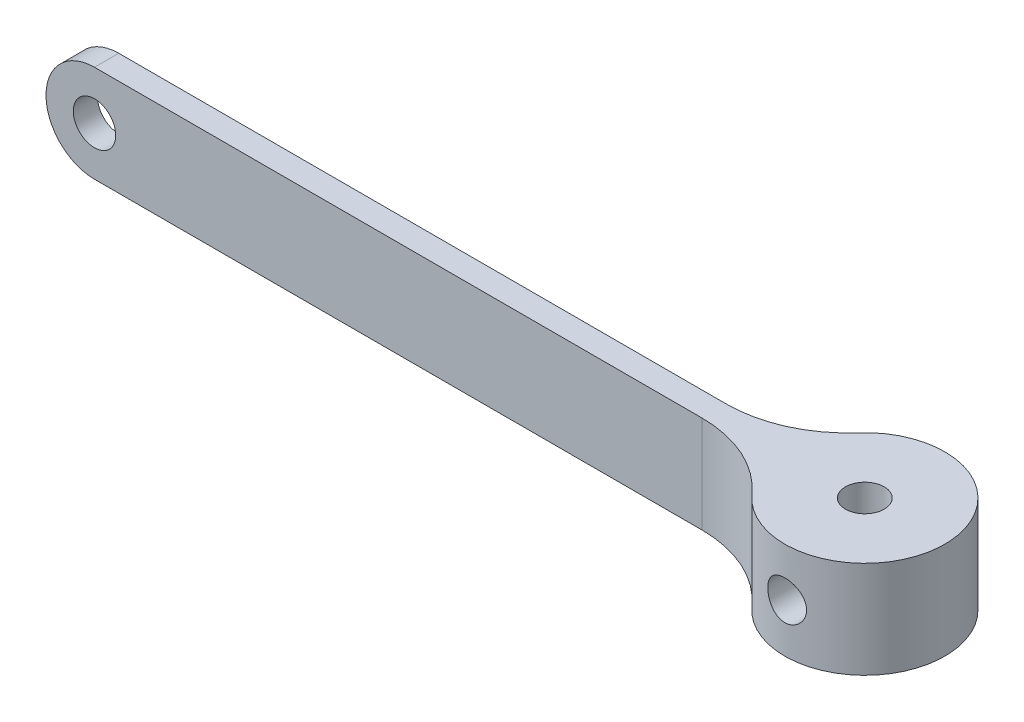
ISO-10303-21;
HEADER;
FILE_DESCRIPTION(('STEP AP214'),'2;1');
FILE_NAME('part.step','',(''),(''),'','','');
FILE_SCHEMA(('AUTOMOTIVE_DESIGN { 1 0 10303 214 1 1 1 1 }'));
ENDSEC;
DATA;
#1=APPLICATION_CONTEXT('core data for automotive mechanical design processes');
#2=APPLICATION_PROTOCOL_DEFINITION('international standard','automotive_design',2000,#1);
#3=PRODUCT_CONTEXT('',#1,'mechanical');
#4=PRODUCT('Part','Part','',(#3));
#5=PRODUCT_RELATED_PRODUCT_CATEGORY('part','',(#4));
#6=PRODUCT_DEFINITION_FORMATION('','',#4);
#7=PRODUCT_DEFINITION_CONTEXT('part definition',#1,'design');
#8=PRODUCT_DEFINITION('design','',#6,#7);
#9=PRODUCT_DEFINITION_SHAPE('','',#8);
#10=(LENGTH_UNIT() NAMED_UNIT(*) SI_UNIT(.MILLI.,.METRE.));
#11=(NAMED_UNIT(*) PLANE_ANGLE_UNIT() SI_UNIT($,.RADIAN.));
#12=(NAMED_UNIT(*) SI_UNIT($,.STERADIAN.) SOLID_ANGLE_UNIT());
#13=UNCERTAINTY_MEASURE_WITH_UNIT(LENGTH_MEASURE(1.E-05),#10,'distance_accuracy_value','');
#14=(GEOMETRIC_REPRESENTATION_CONTEXT(3) GLOBAL_UNCERTAINTY_ASSIGNED_CONTEXT((#13)) GLOBAL_UNIT_ASSIGNED_CONTEXT((#10,
#11,#12)) REPRESENTATION_CONTEXT('',''));
#15=CARTESIAN_POINT('',(0.,0.,0.));
#16=DIRECTION('',(0.,0.,1.));
#17=DIRECTION('',(1.,0.,0.));
#18=AXIS2_PLACEMENT_3D('',#15,#16,#17);
#19=CARTESIAN_POINT('',(0.,8.,0.999999999999998));
#20=DIRECTION('',(0.,0.,1.));
#21=DIRECTION('',(-1.,0.,0.));
#22=AXIS2_PLACEMENT_3D('',#19,#20,#21);
#23=PLANE('',#22);
#24=CARTESIAN_POINT('',(-62.52380257212,4.,0.999999999999998));
#25=DIRECTION('',(0.,0.,-1.));
#26=DIRECTION('',(-1.,0.,0.));
#27=AXIS2_PLACEMENT_3D('',#24,#25,#26);
#28=CIRCLE('',#27,1.75);
#29=CARTESIAN_POINT('',(-60.77380257212,4.,0.999999999999998));
#30=VERTEX_POINT('',#29);
#31=EDGE_CURVE('E126',#30,#30,#28,.T.);
#32=ORIENTED_EDGE('',*,*,#31,.T.);
#33=EDGE_LOOP('',(#32));
#34=FACE_BOUND('',#33,.T.);
#35=DIRECTION('',(1.,0.,0.));
#36=VECTOR('',#35,1.);
#37=CARTESIAN_POINT('',(0.,8.,0.999999999999998));
#38=LINE('',#37,#36);
#39=CARTESIAN_POINT('',(-62.52380257212,8.,1.));
#40=VERTEX_POINT('',#39);
#41=CARTESIAN_POINT('',(-12.432216214336,8.,0.999999999999998));
#42=VERTEX_POINT('',#41);
#43=EDGE_CURVE('E121',#40,#42,#38,.T.);
#44=ORIENTED_EDGE('',*,*,#43,.F.);
#45=CARTESIAN_POINT('',(-62.52380257212,4.,0.999999999999998));
#46=DIRECTION('',(0.,0.,-1.));
#47=DIRECTION('',(-1.,0.,0.));
#48=AXIS2_PLACEMENT_3D('',#45,#46,#47);
#49=CIRCLE('',#48,4.);
#50=CARTESIAN_POINT('',(-62.52380257212,0.,1.));
#51=VERTEX_POINT('',#50);
#52=EDGE_CURVE('E104',#51,#40,#49,.T.);
#53=ORIENTED_EDGE('',*,*,#52,.F.);
#54=DIRECTION('',(1.,0.,0.));
#55=VECTOR('',#54,1.);
#56=CARTESIAN_POINT('',(0.,0.,0.999999999999998));
#57=LINE('',#56,#55);
#58=CARTESIAN_POINT('',(-12.432216214336,0.,0.999999999999998));
#59=VERTEX_POINT('',#58);
#60=EDGE_CURVE('E114',#51,#59,#57,.T.);
#61=ORIENTED_EDGE('',*,*,#60,.T.);
#62=DIRECTION('',(0.,-1.,0.));
#63=VECTOR('',#62,1.);
#64=CARTESIAN_POINT('',(-12.432216214336,8.,0.999999999999998));
#65=LINE('',#64,#63);
#66=EDGE_CURVE('E164',#42,#59,#65,.T.);
#67=ORIENTED_EDGE('',*,*,#66,.F.);
#68=EDGE_LOOP('',(#44,#53,#61,#67));
#69=FACE_BOUND('',#68,.T.);
#70=ADVANCED_FACE('F43',(#34,#69),#23,.T.);
#71=CARTESIAN_POINT('',(0.,8.,-1.));
#72=DIRECTION('',(0.,0.,1.));
#73=DIRECTION('',(-1.,0.,0.));
#74=AXIS2_PLACEMENT_3D('',#71,#72,#73);
#75=PLANE('',#74);
#76=CARTESIAN_POINT('',(-62.52380257212,4.,-1.));
#77=DIRECTION('',(0.,0.,-1.));
#78=DIRECTION('',(-1.,0.,0.));
#79=AXIS2_PLACEMENT_3D('',#76,#77,#78);
#80=CIRCLE('',#79,1.75);
#81=CARTESIAN_POINT('',(-60.77380257212,4.,-1.));
#82=VERTEX_POINT('',#81);
#83=EDGE_CURVE('E154',#82,#82,#80,.T.);
#84=ORIENTED_EDGE('',*,*,#83,.F.);
#85=EDGE_LOOP('',(#84));
#86=FACE_BOUND('',#85,.T.);
#87=DIRECTION('',(1.,0.,0.));
#88=VECTOR('',#87,1.);
#89=CARTESIAN_POINT('',(0.,0.,-1.));
#90=LINE('',#89,#88);
#91=CARTESIAN_POINT('',(-62.52380257212,0.,-0.999999999999997));
#92=VERTEX_POINT('',#91);
#93=CARTESIAN_POINT('',(-12.432216214336,0.,-1.));
#94=VERTEX_POINT('',#93);
#95=EDGE_CURVE('E117',#92,#94,#90,.T.);
#96=ORIENTED_EDGE('',*,*,#95,.F.);
#97=CARTESIAN_POINT('',(-62.52380257212,4.,-1.));
#98=DIRECTION('',(0.,0.,-1.));
#99=DIRECTION('',(-1.,0.,0.));
#100=AXIS2_PLACEMENT_3D('',#97,#98,#99);
#101=CIRCLE('',#100,4.);
#102=CARTESIAN_POINT('',(-62.52380257212,8.,-1.));
#103=VERTEX_POINT('',#102);
#104=EDGE_CURVE('E107',#92,#103,#101,.T.);
#105=ORIENTED_EDGE('',*,*,#104,.T.);
#106=DIRECTION('',(1.,0.,0.));
#107=VECTOR('',#106,1.);
#108=CARTESIAN_POINT('',(0.,8.,-1.));
#109=LINE('',#108,#107);
#110=CARTESIAN_POINT('',(-12.432216214336,8.,-1.));
#111=VERTEX_POINT('',#110);
#112=EDGE_CURVE('E137',#103,#111,#109,.T.);
#113=ORIENTED_EDGE('',*,*,#112,.T.);
#114=DIRECTION('',(0.,1.,0.));
#115=VECTOR('',#114,1.);
#116=CARTESIAN_POINT('',(-12.432216214336,8.,-1.));
#117=LINE('',#116,#115);
#118=EDGE_CURVE('E161',#94,#111,#117,.T.);
#119=ORIENTED_EDGE('',*,*,#118,.F.);
#120=EDGE_LOOP('',(#96,#105,#113,#119));
#121=FACE_BOUND('',#120,.T.);
#122=ADVANCED_FACE('F180',(#86,#121),#75,.F.);
#123=CARTESIAN_POINT('',(0.,8.,0.));
#124=DIRECTION('',(0.,-1.,0.));
#125=DIRECTION('',(0.,0.,1.));
#126=AXIS2_PLACEMENT_3D('',#123,#124,#125);
#127=CYLINDRICAL_SURFACE('',#126,1.6);
#128=CARTESIAN_POINT('',(0.,4.,0.));
#129=DIRECTION('',(0.,0.707106781186548,0.707106781186547));
#130=DIRECTION('',(0.,-0.707106781186548,0.707106781186547));
#131=AXIS2_PLACEMENT_3D('',#128,#129,#130);
#132=ELLIPSE('',#131,2.26274169979695,1.6);
#133=CARTESIAN_POINT('',(-1.6,4.,0.));
#134=VERTEX_POINT('',#133);
#135=CARTESIAN_POINT('',(1.6,4.,0.));
#136=VERTEX_POINT('',#135);
#137=EDGE_CURVE('E150',#134,#136,#132,.F.);
#138=ORIENTED_EDGE('',*,*,#137,.T.);
#139=CARTESIAN_POINT('',(0.,4.,0.));
#140=DIRECTION('',(0.,0.707106781186548,-0.707106781186547));
#141=DIRECTION('',(0.,-0.707106781186548,-0.707106781186547));
#142=AXIS2_PLACEMENT_3D('',#139,#140,#141);
#143=ELLIPSE('',#142,2.26274169979695,1.6);
#144=EDGE_CURVE('E110',#136,#134,#143,.F.);
#145=ORIENTED_EDGE('',*,*,#144,.T.);
#146=EDGE_LOOP('',(#138,#145));
#147=FACE_BOUND('',#146,.T.);
#148=CARTESIAN_POINT('',(0.,8.,0.));
#149=DIRECTION('',(0.,-1.,0.));
#150=DIRECTION('',(0.,0.,-1.));
#151=AXIS2_PLACEMENT_3D('',#148,#149,#150);
#152=CIRCLE('',#151,1.6);
#153=CARTESIAN_POINT('',(0.,8.,-1.6));
#154=VERTEX_POINT('',#153);
#155=EDGE_CURVE('E130',#154,#154,#152,.T.);
#156=ORIENTED_EDGE('',*,*,#155,.F.);
#157=EDGE_LOOP('',(#156));
#158=FACE_BOUND('',#157,.T.);
#159=ADVANCED_FACE('F199',(#147,#158),#127,.F.);
#160=CARTESIAN_POINT('',(0.,0.,0.));
#161=DIRECTION('',(0.,1.,0.));
#162=DIRECTION('',(0.,0.,-1.));
#163=AXIS2_PLACEMENT_3D('',#160,#161,#162);
#164=PLANE('',#163);
#165=CARTESIAN_POINT('',(0.,0.,0.));
#166=DIRECTION('',(0.,-1.,0.));
#167=DIRECTION('',(0.,0.,-1.));
#168=AXIS2_PLACEMENT_3D('',#165,#166,#167);
#169=CIRCLE('',#168,1.6);
#170=CARTESIAN_POINT('',(0.,0.,-1.6));
#171=VERTEX_POINT('',#170);
#172=EDGE_CURVE('E122',#171,#171,#169,.T.);
#173=ORIENTED_EDGE('',*,*,#172,.F.);
#174=EDGE_LOOP('',(#173));
#175=FACE_BOUND('',#174,.T.);
#176=DIRECTION('',(0.,0.,-1.));
#177=VECTOR('',#176,1.);
#178=CARTESIAN_POINT('',(-62.52380257212,0.,6.6));
#179=LINE('',#178,#177);
#180=EDGE_CURVE('E101',#51,#92,#179,.T.);
#181=ORIENTED_EDGE('',*,*,#180,.T.);
#182=ORIENTED_EDGE('',*,*,#95,.T.);
#183=CARTESIAN_POINT('',(-12.432216214336,0.,-11.));
#184=DIRECTION('',(0.,-1.,0.));
#185=DIRECTION('',(0.,0.,-1.));
#186=AXIS2_PLACEMENT_3D('',#183,#184,#185);
#187=CIRCLE('',#186,10.);
#188=CARTESIAN_POINT('',(-4.94292933822999,0.,-4.37349397590361));
#189=VERTEX_POINT('',#188);
#190=EDGE_CURVE('E166',#189,#94,#187,.T.);
#191=ORIENTED_EDGE('',*,*,#190,.F.);
#192=CARTESIAN_POINT('',(0.,0.,0.));
#193=DIRECTION('',(0.,-1.,0.));
#194=DIRECTION('',(0.,0.,-1.));
#195=AXIS2_PLACEMENT_3D('',#192,#193,#194);
#196=CIRCLE('',#195,6.6);
#197=CARTESIAN_POINT('',(-4.94292933822999,0.,4.37349397590361));
#198=VERTEX_POINT('',#197);
#199=EDGE_CURVE('E118',#189,#198,#196,.T.);
#200=ORIENTED_EDGE('',*,*,#199,.T.);
#201=CARTESIAN_POINT('',(-12.432216214336,0.,11.));
#202=DIRECTION('',(0.,-1.,0.));
#203=DIRECTION('',(0.,0.,-1.));
#204=AXIS2_PLACEMENT_3D('',#201,#202,#203);
#205=CIRCLE('',#204,10.);
#206=EDGE_CURVE('E51',#59,#198,#205,.T.);
#207=ORIENTED_EDGE('',*,*,#206,.F.);
#208=ORIENTED_EDGE('',*,*,#60,.F.);
#209=EDGE_LOOP('',(#181,#182,#191,#200,#207,#208));
#210=FACE_BOUND('',#209,.T.);
#211=ADVANCED_FACE('F115',(#175,#210),#164,.F.);
#212=CARTESIAN_POINT('',(0.,8.,0.));
#213=DIRECTION('',(0.,1.,0.));
#214=DIRECTION('',(0.,0.,-1.));
#215=AXIS2_PLACEMENT_3D('',#212,#213,#214);
#216=PLANE('',#215);
#217=ORIENTED_EDGE('',*,*,#155,.T.);
#218=EDGE_LOOP('',(#217));
#219=FACE_BOUND('',#218,.T.);
#220=ORIENTED_EDGE('',*,*,#43,.T.);
#221=CARTESIAN_POINT('',(-12.432216214336,8.,11.));
#222=DIRECTION('',(0.,-1.,0.));
#223=DIRECTION('',(0.,0.,-1.));
#224=AXIS2_PLACEMENT_3D('',#221,#222,#223);
#225=CIRCLE('',#224,10.);
#226=CARTESIAN_POINT('',(-4.94292933822999,8.,4.37349397590361));
#227=VERTEX_POINT('',#226);
#228=EDGE_CURVE('E11',#227,#42,#225,.F.);
#229=ORIENTED_EDGE('',*,*,#228,.F.);
#230=CARTESIAN_POINT('',(0.,8.,0.));
#231=DIRECTION('',(0.,-1.,0.));
#232=DIRECTION('',(0.,0.,-1.));
#233=AXIS2_PLACEMENT_3D('',#230,#231,#232);
#234=CIRCLE('',#233,6.6);
#235=CARTESIAN_POINT('',(-4.94292933822999,8.,-4.37349397590361));
#236=VERTEX_POINT('',#235);
#237=EDGE_CURVE('E133',#236,#227,#234,.T.);
#238=ORIENTED_EDGE('',*,*,#237,.F.);
#239=CARTESIAN_POINT('',(-12.432216214336,8.,-11.));
#240=DIRECTION('',(0.,-1.,0.));
#241=DIRECTION('',(0.,0.,-1.));
#242=AXIS2_PLACEMENT_3D('',#239,#240,#241);
#243=CIRCLE('',#242,10.);
#244=EDGE_CURVE('E168',#111,#236,#243,.F.);
#245=ORIENTED_EDGE('',*,*,#244,.F.);
#246=ORIENTED_EDGE('',*,*,#112,.F.);
#247=DIRECTION('',(0.,0.,-1.));
#248=VECTOR('',#247,1.);
#249=CARTESIAN_POINT('',(-62.52380257212,8.,6.6));
#250=LINE('',#249,#248);
#251=EDGE_CURVE('E111',#40,#103,#250,.T.);
#252=ORIENTED_EDGE('',*,*,#251,.F.);
#253=EDGE_LOOP('',(#220,#229,#238,#245,#246,#252));
#254=FACE_BOUND('',#253,.T.);
#255=ADVANCED_FACE('F176',(#219,#254),#216,.T.);
#256=CARTESIAN_POINT('',(0.,8.,0.));
#257=DIRECTION('',(0.,-1.,0.));
#258=DIRECTION('',(0.,0.,1.));
#259=AXIS2_PLACEMENT_3D('',#256,#257,#258);
#260=CYLINDRICAL_SURFACE('',#259,6.6);
#261=CARTESIAN_POINT('',(1.6,4.,6.40312423743285));
#262=CARTESIAN_POINT('',(1.59999733947836,4.08844402406098,6.40312597037608));
#263=CARTESIAN_POINT('',(1.59264157848281,4.17691809600071,6.40497670400887));
#264=CARTESIAN_POINT('',(1.56345601743318,4.35133182154082,6.4121621325328));
#265=CARTESIAN_POINT('',(1.54161728105349,4.43726987614424,6.41749897840401));
#266=CARTESIAN_POINT('',(1.48420900234039,4.60406355514517,6.43101748536075));
#267=CARTESIAN_POINT('',(1.44865650524925,4.68492534448298,6.43919561368331));
#268=CARTESIAN_POINT('',(1.3648810998873,4.83954379086885,6.45747086045777));
#269=CARTESIAN_POINT('',(1.31665785249964,4.91330025767959,6.46756803026843));
#270=CARTESIAN_POINT('',(1.20784389900135,5.05314159602282,6.48877758318028));
#271=CARTESIAN_POINT('',(1.14703929913897,5.11905772455782,6.49990538881894));
#272=CARTESIAN_POINT('',(1.01524965153105,5.23986289597431,6.5217882988137));
#273=CARTESIAN_POINT('',(0.944263695721746,5.29475095422509,6.53254336981968));
#274=CARTESIAN_POINT('',(0.792976530006599,5.39262652396975,6.55263898037571));
#275=CARTESIAN_POINT('',(0.71256570600993,5.43544913714583,6.56195919706409));
#276=CARTESIAN_POINT('',(0.545423893058168,5.50690743021361,6.57795945463852));
#277=CARTESIAN_POINT('',(0.458693781262912,5.53554507478769,6.5846398611243));
#278=CARTESIAN_POINT('',(0.28313343703087,5.57728248350463,6.59449878121048));
#279=CARTESIAN_POINT('',(0.194374956348101,5.59066857236418,6.59774174354862));
#280=CARTESIAN_POINT('',(0.0158168750524343,5.60242074593819,6.60058464260181));
#281=CARTESIAN_POINT('',(-0.0739825787233717,5.60078892390197,6.60018508702391));
#282=CARTESIAN_POINT('',(-0.25009076322241,5.5827593886002,6.59583627033507));
#283=CARTESIAN_POINT('',(-0.336433231377963,5.56667061845232,6.59196128200833));
#284=CARTESIAN_POINT('',(-0.505154519829912,5.52067938716169,6.58118299179282));
#285=CARTESIAN_POINT('',(-0.587533136198652,5.49077621614884,6.57427953428333));
#286=CARTESIAN_POINT('',(-0.746813265295441,5.41774922909505,6.55810487467464));
#287=CARTESIAN_POINT('',(-0.8236614407911,5.37451366657421,6.54881377443151));
#288=CARTESIAN_POINT('',(-0.969121094903154,5.27613357148008,6.52887450690487));
#289=CARTESIAN_POINT('',(-1.03773121476807,5.22098707855287,6.51822611635086));
#290=CARTESIAN_POINT('',(-1.16660863727456,5.09868762962085,6.49641521034034));
#291=CARTESIAN_POINT('',(-1.22661882104947,5.03126455163238,6.48524650824044));
#292=CARTESIAN_POINT('',(-1.33453585965573,4.88719490884861,6.46390352969242));
#293=CARTESIAN_POINT('',(-1.38244221584308,4.81054796424765,6.45372929422414));
#294=CARTESIAN_POINT('',(-1.46494322915083,4.64972470273884,6.43550637883586));
#295=CARTESIAN_POINT('',(-1.4994794029305,4.56551724795948,6.42746708453676));
#296=CARTESIAN_POINT('',(-1.55382718977604,4.39225039215391,6.41454673226991));
#297=CARTESIAN_POINT('',(-1.57364174189015,4.30319196339657,6.40966504393782));
#298=CARTESIAN_POINT('',(-1.59756435294379,4.12512682937485,6.40374402358904));
#299=CARTESIAN_POINT('',(-1.60205110778769,4.03617402039503,6.40261207062851));
#300=CARTESIAN_POINT('',(-1.59622462099622,3.85879092404816,6.40406713975094));
#301=CARTESIAN_POINT('',(-1.58591265192973,3.77036059240891,6.4066538420601));
#302=CARTESIAN_POINT('',(-1.55111264233716,3.59791634012609,6.41516633208495));
#303=CARTESIAN_POINT('',(-1.52684202876438,3.51385577255964,6.42104086992378));
#304=CARTESIAN_POINT('',(-1.46505330245464,3.35099563472862,6.43541907577093));
#305=CARTESIAN_POINT('',(-1.427533693674,3.27219665978537,6.44392304067414));
#306=CARTESIAN_POINT('',(-1.33950890361332,3.12048324751841,6.46279907110407));
#307=CARTESIAN_POINT('',(-1.28877556385843,3.04770522515797,6.47320288866304));
#308=CARTESIAN_POINT('',(-1.176054449739,2.91155642689974,6.49462703788132));
#309=CARTESIAN_POINT('',(-1.11406494115952,2.84818710331931,6.50564746435902));
#310=CARTESIAN_POINT('',(-0.978859243852804,2.73113684816081,6.52737484171816));
#311=CARTESIAN_POINT('',(-0.905414542587484,2.6777169454476,6.5380684476914));
#312=CARTESIAN_POINT('',(-0.750376177663217,2.58397023624514,6.55766967940658));
#313=CARTESIAN_POINT('',(-0.66878293149163,2.54364275942034,6.56657739657757));
#314=CARTESIAN_POINT('',(-0.500317828978865,2.47756489223356,6.58154809251216));
#315=CARTESIAN_POINT('',(-0.413487967421984,2.45171216041208,6.58763099011155));
#316=CARTESIAN_POINT('',(-0.236550277056997,2.41500676666825,6.59635362322053));
#317=CARTESIAN_POINT('',(-0.146443043735652,2.40415139361489,6.5989939810466));
#318=CARTESIAN_POINT('',(0.0320330834287466,2.39789370197624,6.60051038370048));
#319=CARTESIAN_POINT('',(0.120387845166775,2.4021050810357,6.59948053308083));
#320=CARTESIAN_POINT('',(0.295090603727326,2.42498180031035,6.59397912156365));
#321=CARTESIAN_POINT('',(0.381438653778091,2.44364675669111,6.58950765206303));
#322=CARTESIAN_POINT('',(0.549299070646439,2.49469887896567,6.57763810488231));
#323=CARTESIAN_POINT('',(0.630832598167391,2.52701996018495,6.57025413266408));
#324=CARTESIAN_POINT('',(0.787364816025318,2.60440616156891,6.55333973860274));
#325=CARTESIAN_POINT('',(0.862362725594601,2.64947280163974,6.54380906079289));
#326=CARTESIAN_POINT('',(1.00554031833552,2.75226967813651,6.52336129617945));
#327=CARTESIAN_POINT('',(1.07352623332948,2.81026451788978,6.51241761643753));
#328=CARTESIAN_POINT('',(1.19893242972994,2.93675265363601,6.49050250288316));
#329=CARTESIAN_POINT('',(1.25635006733463,3.00524856878544,6.47953106282008));
#330=CARTESIAN_POINT('',(1.35995880768537,3.15221778456658,6.45858815699281));
#331=CARTESIAN_POINT('',(1.40593901379458,3.23084290180638,6.448637221504));
#332=CARTESIAN_POINT('',(1.48395977964431,3.39493550764195,6.43113315660768));
#333=CARTESIAN_POINT('',(1.51601091235572,3.48039774791219,6.42357820968792));
#334=CARTESIAN_POINT('',(1.56024691692113,3.63814570603387,6.41295817096726));
#335=CARTESIAN_POINT('',(1.57512286070378,3.70964864102359,6.40929733413103));
#336=CARTESIAN_POINT('',(1.59500013121856,3.85409430607224,6.40437974225737));
#337=CARTESIAN_POINT('',(1.60000219483265,3.92703692827776,6.40312280781832));
#338=CARTESIAN_POINT('',(1.6,4.,6.40312423743285));
#339=B_SPLINE_CURVE_WITH_KNOTS('',3,(#261,#262,#263,#264,#265,#266,#267,#268,#269,#270,#271,
#272,#273,#274,#275,#276,#277,#278,#279,#280,#281,#282,#283,#284,#285,#286,#287,#288,#289,#290,
#291,#292,#293,#294,#295,#296,#297,#298,#299,#300,#301,#302,#303,#304,#305,#306,#307,#308,#309,
#310,#311,#312,#313,#314,#315,#316,#317,#318,#319,#320,#321,#322,#323,#324,#325,#326,#327,#328,
#329,#330,#331,#332,#333,#334,#335,#336,#337,#338),.UNSPECIFIED.,.T.,.F.,(4,2,2,2,2,2,2,2,2,2,2,
2,2,2,2,2,2,2,2,2,2,2,2,2,2,2,2,2,2,2,2,2,2,2,2,2,2,2,4),(0.,0.265064273258436,
0.530292249566571,0.795191622869192,1.0600980865956,1.32994540119492,1.59981679815771,
1.87321504847942,2.14657542130955,2.41471463941518,2.68281648389817,2.94532180998148,
3.20784062672676,3.47262248908861,3.73744796368044,4.00902119378664,4.28060561013037,
4.55336490852977,4.82606973818099,5.09198626575298,5.35787992805489,5.619739930883,
5.88162951175322,6.1483813618781,6.41517434484027,6.68820231251325,6.96121629887957,
7.23227478485269,7.50328426411234,7.76739558504667,8.03149989238554,8.29434052625653,
8.55721251706291,8.82606066778539,9.09497598347789,9.36853321512672,9.64188243681685,
9.86056704862862,10.0792353395176),.UNSPECIFIED.);
#340=CARTESIAN_POINT('',(1.6,4.,6.40312423743285));
#341=VERTEX_POINT('',#340);
#342=EDGE_CURVE('E157',#341,#341,#339,.T.);
#343=ORIENTED_EDGE('',*,*,#342,.F.);
#344=EDGE_LOOP('',(#343));
#345=FACE_BOUND('',#344,.T.);
#346=CARTESIAN_POINT('',(1.6,4.,-6.40312423743285));
#347=CARTESIAN_POINT('',(1.59999733947836,3.91155597593902,-6.40312597037608));
#348=CARTESIAN_POINT('',(1.59264157848281,3.82308190399929,-6.40497670400887));
#349=CARTESIAN_POINT('',(1.56345601743318,3.64866817845918,-6.4121621325328));
#350=CARTESIAN_POINT('',(1.54161728105349,3.56273012385576,-6.41749897840401));
#351=CARTESIAN_POINT('',(1.48420900234039,3.39593644485483,-6.43101748536075));
#352=CARTESIAN_POINT('',(1.44865650524925,3.31507465551702,-6.43919561368331));
#353=CARTESIAN_POINT('',(1.3648810998873,3.16045620913115,-6.45747086045777));
#354=CARTESIAN_POINT('',(1.31665785249964,3.08669974232041,-6.46756803026843));
#355=CARTESIAN_POINT('',(1.20784389900135,2.94685840397718,-6.48877758318028));
#356=CARTESIAN_POINT('',(1.14703929913897,2.88094227544218,-6.49990538881894));
#357=CARTESIAN_POINT('',(1.01524965153105,2.76013710402569,-6.5217882988137));
#358=CARTESIAN_POINT('',(0.944263695721746,2.70524904577491,-6.53254336981968));
#359=CARTESIAN_POINT('',(0.792976530006598,2.60737347603025,-6.55263898037571));
#360=CARTESIAN_POINT('',(0.712565706009929,2.56455086285417,-6.56195919706409));
#361=CARTESIAN_POINT('',(0.545423893058167,2.49309256978639,-6.57795945463852));
#362=CARTESIAN_POINT('',(0.458693781262911,2.46445492521231,-6.5846398611243));
#363=CARTESIAN_POINT('',(0.283133437030869,2.42271751649537,-6.59449878121048));
#364=CARTESIAN_POINT('',(0.1943749563481,2.40933142763582,-6.59774174354862));
#365=CARTESIAN_POINT('',(0.0158168750524331,2.39757925406181,-6.60058464260181));
#366=CARTESIAN_POINT('',(-0.073982578723373,2.39921107609803,-6.60018508702391));
#367=CARTESIAN_POINT('',(-0.250090763222411,2.4172406113998,-6.59583627033507));
#368=CARTESIAN_POINT('',(-0.336433231377964,2.43332938154768,-6.59196128200833));
#369=CARTESIAN_POINT('',(-0.505154519829913,2.47932061283831,-6.58118299179282));
#370=CARTESIAN_POINT('',(-0.587533136198654,2.50922378385116,-6.57427953428333));
#371=CARTESIAN_POINT('',(-0.746813265295443,2.58225077090495,-6.55810487467464));
#372=CARTESIAN_POINT('',(-0.823661440791102,2.62548633342579,-6.54881377443151));
#373=CARTESIAN_POINT('',(-0.969121094903156,2.72386642851992,-6.52887450690487));
#374=CARTESIAN_POINT('',(-1.03773121476807,2.77901292144713,-6.51822611635086));
#375=CARTESIAN_POINT('',(-1.16660863727457,2.90131237037916,-6.49641521034034));
#376=CARTESIAN_POINT('',(-1.22661882104947,2.96873544836762,-6.48524650824044));
#377=CARTESIAN_POINT('',(-1.33453585965573,3.11280509115139,-6.46390352969242));
#378=CARTESIAN_POINT('',(-1.38244221584308,3.18945203575236,-6.45372929422414));
#379=CARTESIAN_POINT('',(-1.46494322915083,3.35027529726117,-6.43550637883586));
#380=CARTESIAN_POINT('',(-1.4994794029305,3.43448275204052,-6.42746708453676));
#381=CARTESIAN_POINT('',(-1.55382718977604,3.60774960784609,-6.41454673226991));
#382=CARTESIAN_POINT('',(-1.57364174189015,3.69680803660343,-6.40966504393782));
#383=CARTESIAN_POINT('',(-1.59756435294379,3.87487317062515,-6.40374402358904));
#384=CARTESIAN_POINT('',(-1.60205110778769,3.96382597960497,-6.40261207062851));
#385=CARTESIAN_POINT('',(-1.59622462099622,4.14120907595185,-6.40406713975094));
#386=CARTESIAN_POINT('',(-1.58591265192973,4.22963940759109,-6.4066538420601));
#387=CARTESIAN_POINT('',(-1.55111264233716,4.40208365987391,-6.41516633208495));
#388=CARTESIAN_POINT('',(-1.52684202876438,4.48614422744036,-6.42104086992378));
#389=CARTESIAN_POINT('',(-1.46505330245464,4.64900436527138,-6.43541907577093));
#390=CARTESIAN_POINT('',(-1.427533693674,4.72780334021463,-6.44392304067414));
#391=CARTESIAN_POINT('',(-1.33950890361332,4.87951675248159,-6.46279907110407));
#392=CARTESIAN_POINT('',(-1.28877556385843,4.95229477484203,-6.47320288866304));
#393=CARTESIAN_POINT('',(-1.176054449739,5.08844357310027,-6.49462703788132));
#394=CARTESIAN_POINT('',(-1.11406494115952,5.15181289668069,-6.50564746435902));
#395=CARTESIAN_POINT('',(-0.978859243852804,5.2688631518392,-6.52737484171816));
#396=CARTESIAN_POINT('',(-0.905414542587483,5.3222830545524,-6.5380684476914));
#397=CARTESIAN_POINT('',(-0.750376177663216,5.41602976375486,-6.55766967940658));
#398=CARTESIAN_POINT('',(-0.66878293149163,5.45635724057966,-6.56657739657757));
#399=CARTESIAN_POINT('',(-0.500317828978864,5.52243510776645,-6.58154809251216));
#400=CARTESIAN_POINT('',(-0.413487967421984,5.54828783958792,-6.58763099011155));
#401=CARTESIAN_POINT('',(-0.236550277056997,5.58499323333175,-6.59635362322053));
#402=CARTESIAN_POINT('',(-0.146443043735651,5.59584860638511,-6.5989939810466));
#403=CARTESIAN_POINT('',(0.0320330834287479,5.60210629802376,-6.60051038370048));
#404=CARTESIAN_POINT('',(0.120387845166776,5.5978949189643,-6.59948053308083));
#405=CARTESIAN_POINT('',(0.295090603727328,5.57501819968965,-6.59397912156365));
#406=CARTESIAN_POINT('',(0.381438653778093,5.55635324330889,-6.58950765206303));
#407=CARTESIAN_POINT('',(0.549299070646441,5.50530112103433,-6.57763810488231));
#408=CARTESIAN_POINT('',(0.630832598167393,5.47298003981504,-6.57025413266408));
#409=CARTESIAN_POINT('',(0.787364816025321,5.39559383843108,-6.55333973860274));
#410=CARTESIAN_POINT('',(0.862362725594603,5.35052719836026,-6.54380906079289));
#411=CARTESIAN_POINT('',(1.00554031833552,5.24773032186349,-6.52336129617945));
#412=CARTESIAN_POINT('',(1.07352623332948,5.18973548211022,-6.51241761643753));
#413=CARTESIAN_POINT('',(1.19893242972994,5.06324734636399,-6.49050250288316));
#414=CARTESIAN_POINT('',(1.25635006733463,4.99475143121456,-6.47953106282008));
#415=CARTESIAN_POINT('',(1.35995880768537,4.84778221543341,-6.45858815699281));
#416=CARTESIAN_POINT('',(1.40593901379458,4.76915709819361,-6.448637221504));
#417=CARTESIAN_POINT('',(1.48395977964431,4.60506449235805,-6.43113315660768));
#418=CARTESIAN_POINT('',(1.51601091235572,4.51960225208781,-6.42357820968792));
#419=CARTESIAN_POINT('',(1.56024691692113,4.36185429396613,-6.41295817096726));
#420=CARTESIAN_POINT('',(1.57512286070378,4.29035135897641,-6.40929733413103));
#421=CARTESIAN_POINT('',(1.59500013121856,4.14590569392776,-6.40437974225737));
#422=CARTESIAN_POINT('',(1.60000219483265,4.07296307172224,-6.40312280781832));
#423=CARTESIAN_POINT('',(1.6,4.,-6.40312423743285));
#424=B_SPLINE_CURVE_WITH_KNOTS('',3,(#346,#347,#348,#349,#350,#351,#352,#353,#354,#355,#356,
#357,#358,#359,#360,#361,#362,#363,#364,#365,#366,#367,#368,#369,#370,#371,#372,#373,#374,#375,
#376,#377,#378,#379,#380,#381,#382,#383,#384,#385,#386,#387,#388,#389,#390,#391,#392,#393,#394,
#395,#396,#397,#398,#399,#400,#401,#402,#403,#404,#405,#406,#407,#408,#409,#410,#411,#412,#413,
#414,#415,#416,#417,#418,#419,#420,#421,#422,#423),.UNSPECIFIED.,.T.,.F.,(4,2,2,2,2,2,2,2,2,2,2,
2,2,2,2,2,2,2,2,2,2,2,2,2,2,2,2,2,2,2,2,2,2,2,2,2,2,2,4),(0.,0.265064273258436,
0.530292249566571,0.795191622869192,1.0600980865956,1.32994540119492,1.59981679815771,
1.87321504847942,2.14657542130955,2.41471463941518,2.68281648389817,2.94532180998148,
3.20784062672676,3.47262248908861,3.73744796368044,4.00902119378665,4.28060561013037,
4.55336490852977,4.82606973818099,5.09198626575298,5.3578799280549,5.619739930883,
5.88162951175322,6.1483813618781,6.41517434484028,6.68820231251325,6.96121629887958,
7.23227478485269,7.50328426411234,7.76739558504667,8.03149989238554,8.29434052625654,
8.55721251706292,8.82606066778539,9.0949759834779,9.36853321512673,9.64188243681686,
9.86056704862863,10.0792353395176),.UNSPECIFIED.);
#425=CARTESIAN_POINT('',(1.6,4.,-6.40312423743285));
#426=VERTEX_POINT('',#425);
#427=EDGE_CURVE('E211',#426,#426,#424,.T.);
#428=ORIENTED_EDGE('',*,*,#427,.F.);
#429=EDGE_LOOP('',(#428));
#430=FACE_BOUND('',#429,.T.);
#431=ORIENTED_EDGE('',*,*,#237,.T.);
#432=DIRECTION('',(0.,-1.,0.));
#433=VECTOR('',#432,1.);
#434=CARTESIAN_POINT('',(-4.94292933822999,8.,4.37349397590361));
#435=LINE('',#434,#433);
#436=EDGE_CURVE('E153',#198,#227,#435,.F.);
#437=ORIENTED_EDGE('',*,*,#436,.F.);
#438=ORIENTED_EDGE('',*,*,#199,.F.);
#439=DIRECTION('',(0.,-1.,0.));
#440=VECTOR('',#439,1.);
#441=CARTESIAN_POINT('',(-4.94292933822999,8.,-4.37349397590361));
#442=LINE('',#441,#440);
#443=EDGE_CURVE('E159',#236,#189,#442,.T.);
#444=ORIENTED_EDGE('',*,*,#443,.F.);
#445=EDGE_LOOP('',(#431,#437,#438,#444));
#446=FACE_BOUND('',#445,.T.);
#447=ADVANCED_FACE('F173',(#345,#430,#446),#260,.T.);
#448=CARTESIAN_POINT('',(0.,4.,0.));
#449=DIRECTION('',(0.,0.707106781186548,0.707106781186547));
#450=DIRECTION('',(0.,-0.707106781186548,0.707106781186547));
#451=AXIS2_PLACEMENT_3D('',#448,#449,#450);
#452=ELLIPSE('',#451,2.26274169979695,1.6);
#453=EDGE_CURVE('E147',#134,#136,#452,.T.);
#454=ORIENTED_EDGE('',*,*,#453,.T.);
#455=CARTESIAN_POINT('',(0.,4.,0.));
#456=DIRECTION('',(0.,0.707106781186548,-0.707106781186547));
#457=DIRECTION('',(0.,-0.707106781186548,-0.707106781186547));
#458=AXIS2_PLACEMENT_3D('',#455,#456,#457);
#459=ELLIPSE('',#458,2.26274169979695,1.6);
#460=EDGE_CURVE('E145',#136,#134,#459,.T.);
#461=ORIENTED_EDGE('',*,*,#460,.T.);
#462=EDGE_LOOP('',(#454,#461));
#463=FACE_BOUND('',#462,.T.);
#464=ORIENTED_EDGE('',*,*,#172,.T.);
#465=EDGE_LOOP('',(#464));
#466=FACE_BOUND('',#465,.T.);
#467=ADVANCED_FACE('F207',(#463,#466),#127,.F.);
#468=CARTESIAN_POINT('',(-62.52380257212,4.,6.6));
#469=DIRECTION('',(0.,0.,-1.));
#470=DIRECTION('',(1.,0.,0.));
#471=AXIS2_PLACEMENT_3D('',#468,#469,#470);
#472=CYLINDRICAL_SURFACE('',#471,4.);
#473=ORIENTED_EDGE('',*,*,#52,.T.);
#474=ORIENTED_EDGE('',*,*,#251,.T.);
#475=ORIENTED_EDGE('',*,*,#104,.F.);
#476=ORIENTED_EDGE('',*,*,#180,.F.);
#477=EDGE_LOOP('',(#473,#474,#475,#476));
#478=FACE_BOUND('',#477,.T.);
#479=ADVANCED_FACE('F102',(#478),#472,.T.);
#480=CARTESIAN_POINT('',(0.,4.,6.6));
#481=DIRECTION('',(0.,0.,-1.));
#482=DIRECTION('',(1.,0.,0.));
#483=AXIS2_PLACEMENT_3D('',#480,#481,#482);
#484=CYLINDRICAL_SURFACE('',#483,1.6);
#485=ORIENTED_EDGE('',*,*,#453,.F.);
#486=ORIENTED_EDGE('',*,*,#144,.F.);
#487=EDGE_LOOP('',(#485,#486));
#488=FACE_BOUND('',#487,.T.);
#489=ORIENTED_EDGE('',*,*,#342,.T.);
#490=EDGE_LOOP('',(#489));
#491=FACE_BOUND('',#490,.T.);
#492=ADVANCED_FACE('F221',(#488,#491),#484,.F.);
#493=ORIENTED_EDGE('',*,*,#137,.F.);
#494=ORIENTED_EDGE('',*,*,#460,.F.);
#495=EDGE_LOOP('',(#493,#494));
#496=FACE_BOUND('',#495,.T.);
#497=ORIENTED_EDGE('',*,*,#427,.T.);
#498=EDGE_LOOP('',(#497));
#499=FACE_BOUND('',#498,.T.);
#500=ADVANCED_FACE('F189',(#496,#499),#484,.F.);
#501=CARTESIAN_POINT('',(-62.52380257212,4.,6.6));
#502=DIRECTION('',(0.,0.,-1.));
#503=DIRECTION('',(1.,0.,0.));
#504=AXIS2_PLACEMENT_3D('',#501,#502,#503);
#505=CYLINDRICAL_SURFACE('',#504,1.75);
#506=CARTESIAN_POINT('',(-60.77380257212,4.,0.999999999999998));
#507=CARTESIAN_POINT('',(-60.77380257212,4.,0.979166666666665));
#508=CARTESIAN_POINT('',(-60.77380257212,4.,0.958333333333332));
#509=CARTESIAN_POINT('',(-60.77380257212,4.,0.916666666666665));
#510=CARTESIAN_POINT('',(-60.77380257212,4.,0.895833333333331));
#511=CARTESIAN_POINT('',(-60.77380257212,4.,0.854166666666665));
#512=CARTESIAN_POINT('',(-60.77380257212,4.,0.833333333333331));
#513=CARTESIAN_POINT('',(-60.77380257212,4.,0.791666666666665));
#514=CARTESIAN_POINT('',(-60.77380257212,4.,0.770833333333331));
#515=CARTESIAN_POINT('',(-60.77380257212,4.,0.729166666666665));
#516=CARTESIAN_POINT('',(-60.77380257212,4.,0.708333333333331));
#517=CARTESIAN_POINT('',(-60.77380257212,4.,0.666666666666665));
#518=CARTESIAN_POINT('',(-60.77380257212,4.,0.645833333333331));
#519=CARTESIAN_POINT('',(-60.77380257212,4.,0.604166666666665));
#520=CARTESIAN_POINT('',(-60.77380257212,4.,0.583333333333331));
#521=CARTESIAN_POINT('',(-60.77380257212,4.,0.541666666666665));
#522=CARTESIAN_POINT('',(-60.77380257212,4.,0.520833333333331));
#523=CARTESIAN_POINT('',(-60.77380257212,4.,0.479166666666664));
#524=CARTESIAN_POINT('',(-60.77380257212,4.,0.458333333333331));
#525=CARTESIAN_POINT('',(-60.77380257212,4.,0.416666666666665));
#526=CARTESIAN_POINT('',(-60.77380257212,4.,0.395833333333332));
#527=CARTESIAN_POINT('',(-60.77380257212,4.,0.354166666666665));
#528=CARTESIAN_POINT('',(-60.77380257212,4.,0.333333333333332));
#529=CARTESIAN_POINT('',(-60.77380257212,4.,0.291666666666665));
#530=CARTESIAN_POINT('',(-60.77380257212,4.,0.270833333333332));
#531=CARTESIAN_POINT('',(-60.77380257212,4.,0.229166666666665));
#532=CARTESIAN_POINT('',(-60.77380257212,4.,0.208333333333332));
#533=CARTESIAN_POINT('',(-60.77380257212,4.,0.166666666666665));
#534=CARTESIAN_POINT('',(-60.77380257212,4.,0.145833333333332));
#535=CARTESIAN_POINT('',(-60.77380257212,4.,0.104166666666665));
#536=CARTESIAN_POINT('',(-60.77380257212,4.,0.0833333333333317));
#537=CARTESIAN_POINT('',(-60.77380257212,4.,0.041666666666665));
#538=CARTESIAN_POINT('',(-60.77380257212,4.,0.0208333333333316));
#539=CARTESIAN_POINT('',(-60.77380257212,4.,-0.0208333333333351));
#540=CARTESIAN_POINT('',(-60.77380257212,4.,-0.0416666666666684));
#541=CARTESIAN_POINT('',(-60.77380257212,4.,-0.0833333333333351));
#542=CARTESIAN_POINT('',(-60.77380257212,4.,-0.104166666666668));
#543=CARTESIAN_POINT('',(-60.77380257212,4.,-0.145833333333335));
#544=CARTESIAN_POINT('',(-60.77380257212,4.,-0.166666666666669));
#545=CARTESIAN_POINT('',(-60.77380257212,4.,-0.208333333333335));
#546=CARTESIAN_POINT('',(-60.77380257212,4.,-0.229166666666669));
#547=CARTESIAN_POINT('',(-60.77380257212,4.,-0.270833333333335));
#548=CARTESIAN_POINT('',(-60.77380257212,4.,-0.291666666666669));
#549=CARTESIAN_POINT('',(-60.77380257212,4.,-0.333333333333335));
#550=CARTESIAN_POINT('',(-60.77380257212,4.,-0.354166666666668));
#551=CARTESIAN_POINT('',(-60.77380257212,4.,-0.395833333333335));
#552=CARTESIAN_POINT('',(-60.77380257212,4.,-0.416666666666668));
#553=CARTESIAN_POINT('',(-60.77380257212,4.,-0.458333333333335));
#554=CARTESIAN_POINT('',(-60.77380257212,4.,-0.479166666666668));
#555=CARTESIAN_POINT('',(-60.77380257212,4.,-0.520833333333335));
#556=CARTESIAN_POINT('',(-60.77380257212,4.,-0.541666666666668));
#557=CARTESIAN_POINT('',(-60.77380257212,4.,-0.583333333333335));
#558=CARTESIAN_POINT('',(-60.77380257212,4.,-0.604166666666668));
#559=CARTESIAN_POINT('',(-60.77380257212,4.,-0.645833333333335));
#560=CARTESIAN_POINT('',(-60.77380257212,4.,-0.666666666666668));
#561=CARTESIAN_POINT('',(-60.77380257212,4.,-0.708333333333335));
#562=CARTESIAN_POINT('',(-60.77380257212,4.,-0.729166666666668));
#563=CARTESIAN_POINT('',(-60.77380257212,4.,-0.770833333333335));
#564=CARTESIAN_POINT('',(-60.77380257212,4.,-0.791666666666668));
#565=CARTESIAN_POINT('',(-60.77380257212,4.,-0.833333333333335));
#566=CARTESIAN_POINT('',(-60.77380257212,4.,-0.854166666666668));
#567=CARTESIAN_POINT('',(-60.77380257212,4.,-0.895833333333335));
#568=CARTESIAN_POINT('',(-60.77380257212,4.,-0.916666666666668));
#569=CARTESIAN_POINT('',(-60.77380257212,4.,-0.958333333333335));
#570=CARTESIAN_POINT('',(-60.77380257212,4.,-0.979166666666668));
#571=CARTESIAN_POINT('',(-60.77380257212,4.,-1.));
#572=B_SPLINE_CURVE_WITH_KNOTS('',3,(#506,#507,#508,#509,#510,#511,#512,#513,#514,#515,#516,
#517,#518,#519,#520,#521,#522,#523,#524,#525,#526,#527,#528,#529,#530,#531,#532,#533,#534,#535,
#536,#537,#538,#539,#540,#541,#542,#543,#544,#545,#546,#547,#548,#549,#550,#551,#552,#553,#554,
#555,#556,#557,#558,#559,#560,#561,#562,#563,#564,#565,#566,#567,#568,#569,#570,#571),
.UNSPECIFIED.,.F.,.F.,(4,2,2,2,2,2,2,2,2,2,2,2,2,2,2,2,2,2,2,2,2,2,2,2,2,2,2,2,2,2,2,2,4),(0.,
0.0625000000000001,0.125,0.1875,0.25,0.3125,0.375,0.4375,0.5,0.5625,0.625,0.6875,0.75,0.8125,
0.875,0.9375,1.,1.0625,1.125,1.1875,1.25,1.3125,1.375,1.4375,1.5,1.5625,1.625,1.6875,1.75,
1.8125,1.875,1.9375,2.),.UNSPECIFIED.);
#573=EDGE_CURVE('BSEAM184',#30,#82,#572,.T.);
#574=ORIENTED_EDGE('',*,*,#31,.F.);
#575=ORIENTED_EDGE('',*,*,#83,.T.);
#576=ORIENTED_EDGE('',*,*,#573,.T.);
#577=ORIENTED_EDGE('',*,*,#573,.F.);
#578=EDGE_LOOP('',(#574,#576,#575,#577));
#579=FACE_BOUND('',#578,.T.);
#580=ADVANCED_FACE('F184',(#579),#505,.F.);
#581=CARTESIAN_POINT('',(-12.432216214336,8.,-11.));
#582=DIRECTION('',(0.,-1.,0.));
#583=DIRECTION('',(0.,0.,1.));
#584=AXIS2_PLACEMENT_3D('',#581,#582,#583);
#585=CYLINDRICAL_SURFACE('',#584,10.);
#586=ORIENTED_EDGE('',*,*,#244,.T.);
#587=ORIENTED_EDGE('',*,*,#443,.T.);
#588=ORIENTED_EDGE('',*,*,#190,.T.);
#589=ORIENTED_EDGE('',*,*,#118,.T.);
#590=EDGE_LOOP('',(#586,#587,#588,#589));
#591=FACE_BOUND('',#590,.T.);
#592=ADVANCED_FACE('F182',(#591),#585,.F.);
#593=CARTESIAN_POINT('',(-12.432216214336,8.,11.));
#594=DIRECTION('',(0.,-1.,0.));
#595=DIRECTION('',(0.,0.,1.));
#596=AXIS2_PLACEMENT_3D('',#593,#594,#595);
#597=CYLINDRICAL_SURFACE('',#596,10.);
#598=ORIENTED_EDGE('',*,*,#228,.T.);
#599=ORIENTED_EDGE('',*,*,#66,.T.);
#600=ORIENTED_EDGE('',*,*,#206,.T.);
#601=ORIENTED_EDGE('',*,*,#436,.T.);
#602=EDGE_LOOP('',(#598,#599,#600,#601));
#603=FACE_BOUND('',#602,.T.);
#604=ADVANCED_FACE('F45',(#603),#597,.F.);
#605=CLOSED_SHELL('',(#70,#122,#159,#211,#255,#447,#467,#479,#492,#500,#580,#592,#604));
#606=MANIFOLD_SOLID_BREP('B2',#605);
#607=ADVANCED_BREP_SHAPE_REPRESENTATION('',(#18,#606),#14);
#608=SHAPE_DEFINITION_REPRESENTATION(#9,#607);
ENDSEC;
END-ISO-10303-21;
